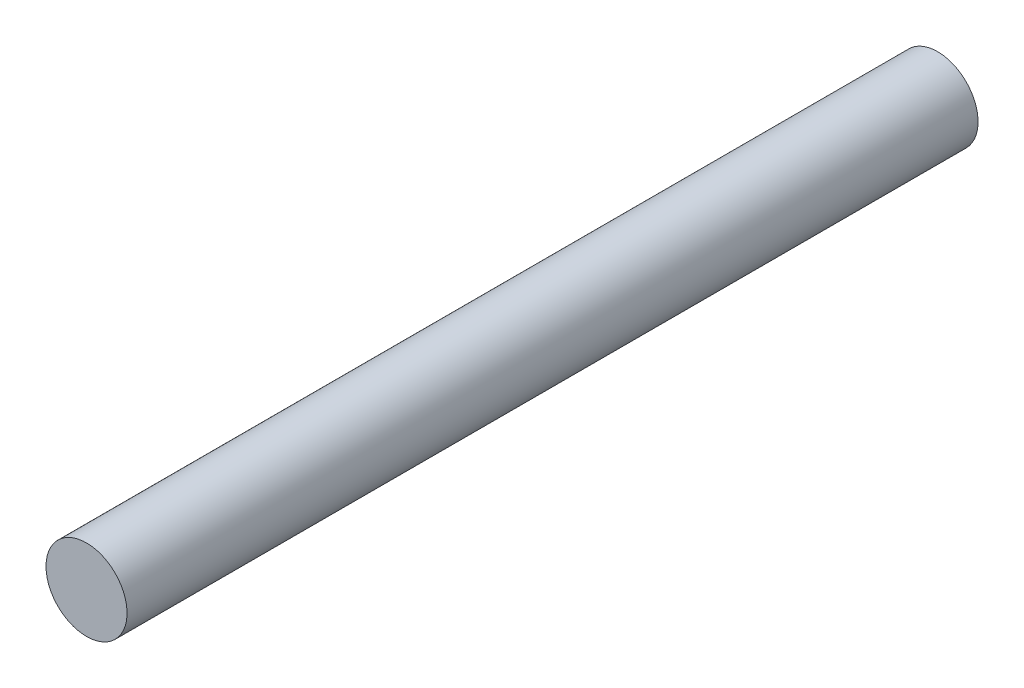
ISO-10303-21;
HEADER;
FILE_DESCRIPTION(('STEP AP214'),'2;1');
FILE_NAME('part.step','',(''),(''),'','','');
FILE_SCHEMA(('AUTOMOTIVE_DESIGN { 1 0 10303 214 1 1 1 1 }'));
ENDSEC;
DATA;
#1=APPLICATION_CONTEXT('core data for automotive mechanical design processes');
#2=APPLICATION_PROTOCOL_DEFINITION('international standard','automotive_design',2000,#1);
#3=PRODUCT_CONTEXT('',#1,'mechanical');
#4=PRODUCT('Part','Part','',(#3));
#5=PRODUCT_RELATED_PRODUCT_CATEGORY('part','',(#4));
#6=PRODUCT_DEFINITION_FORMATION('','',#4);
#7=PRODUCT_DEFINITION_CONTEXT('part definition',#1,'design');
#8=PRODUCT_DEFINITION('design','',#6,#7);
#9=PRODUCT_DEFINITION_SHAPE('','',#8);
#10=(LENGTH_UNIT() NAMED_UNIT(*) SI_UNIT(.MILLI.,.METRE.));
#11=(NAMED_UNIT(*) PLANE_ANGLE_UNIT() SI_UNIT($,.RADIAN.));
#12=(NAMED_UNIT(*) SI_UNIT($,.STERADIAN.) SOLID_ANGLE_UNIT());
#13=UNCERTAINTY_MEASURE_WITH_UNIT(LENGTH_MEASURE(1.E-05),#10,'distance_accuracy_value','');
#14=(GEOMETRIC_REPRESENTATION_CONTEXT(3) GLOBAL_UNCERTAINTY_ASSIGNED_CONTEXT((#13)) GLOBAL_UNIT_ASSIGNED_CONTEXT((#10,
#11,#12)) REPRESENTATION_CONTEXT('',''));
#15=CARTESIAN_POINT('',(0.,0.,0.));
#16=DIRECTION('',(0.,0.,1.));
#17=DIRECTION('',(1.,0.,0.));
#18=AXIS2_PLACEMENT_3D('',#15,#16,#17);
#19=CARTESIAN_POINT('',(0.,0.,0.));
#20=DIRECTION('',(0.,0.,1.));
#21=DIRECTION('',(1.,0.,0.));
#22=AXIS2_PLACEMENT_3D('',#19,#20,#21);
#23=PLANE('',#22);
#24=CARTESIAN_POINT('',(0.,0.,0.));
#25=DIRECTION('',(0.,0.,1.));
#26=DIRECTION('',(1.,0.,0.));
#27=AXIS2_PLACEMENT_3D('',#24,#25,#26);
#28=CIRCLE('',#27,5.);
#29=CARTESIAN_POINT('',(-5.,0.,0.));
#30=VERTEX_POINT('',#29);
#31=EDGE_CURVE('E38',#30,#30,#28,.T.);
#32=ORIENTED_EDGE('',*,*,#31,.F.);
#33=EDGE_LOOP('',(#32));
#34=FACE_BOUND('',#33,.T.);
#35=ADVANCED_FACE('F31',(#34),#23,.F.);
#36=CARTESIAN_POINT('',(0.,0.,119.142135623731));
#37=DIRECTION('',(0.,0.,-1.));
#38=DIRECTION('',(-1.,0.,0.));
#39=AXIS2_PLACEMENT_3D('',#36,#37,#38);
#40=CYLINDRICAL_SURFACE('',#39,5.);
#41=CARTESIAN_POINT('',(0.,0.,105.));
#42=DIRECTION('',(0.,0.,-1.));
#43=DIRECTION('',(0.,1.,0.));
#44=AXIS2_PLACEMENT_3D('',#41,#42,#43);
#45=CIRCLE('',#44,5.);
#46=CARTESIAN_POINT('',(-5.,0.,105.));
#47=VERTEX_POINT('',#46);
#48=EDGE_CURVE('E10',#47,#47,#45,.T.);
#49=CARTESIAN_POINT('',(-5.,0.,105.));
#50=CARTESIAN_POINT('',(-5.,0.,103.90625));
#51=CARTESIAN_POINT('',(-5.,0.,102.8125));
#52=CARTESIAN_POINT('',(-5.,0.,100.625));
#53=CARTESIAN_POINT('',(-5.,0.,99.53125));
#54=CARTESIAN_POINT('',(-5.,0.,97.34375));
#55=CARTESIAN_POINT('',(-5.,0.,96.25));
#56=CARTESIAN_POINT('',(-5.,0.,94.0625));
#57=CARTESIAN_POINT('',(-5.,0.,92.96875));
#58=CARTESIAN_POINT('',(-5.,0.,90.78125));
#59=CARTESIAN_POINT('',(-5.,0.,89.6875));
#60=CARTESIAN_POINT('',(-5.,0.,87.5));
#61=CARTESIAN_POINT('',(-5.,0.,86.40625));
#62=CARTESIAN_POINT('',(-5.,0.,84.21875));
#63=CARTESIAN_POINT('',(-5.,0.,83.125));
#64=CARTESIAN_POINT('',(-5.,0.,80.9375));
#65=CARTESIAN_POINT('',(-5.,0.,79.84375));
#66=CARTESIAN_POINT('',(-5.,0.,77.65625));
#67=CARTESIAN_POINT('',(-5.,0.,76.5625));
#68=CARTESIAN_POINT('',(-5.,0.,74.375));
#69=CARTESIAN_POINT('',(-5.,0.,73.28125));
#70=CARTESIAN_POINT('',(-5.,0.,71.09375));
#71=CARTESIAN_POINT('',(-5.,0.,70.));
#72=CARTESIAN_POINT('',(-5.,0.,67.8125));
#73=CARTESIAN_POINT('',(-5.,0.,66.71875));
#74=CARTESIAN_POINT('',(-5.,0.,64.53125));
#75=CARTESIAN_POINT('',(-5.,0.,63.4375));
#76=CARTESIAN_POINT('',(-5.,0.,61.25));
#77=CARTESIAN_POINT('',(-5.,0.,60.15625));
#78=CARTESIAN_POINT('',(-5.,0.,57.96875));
#79=CARTESIAN_POINT('',(-5.,0.,56.875));
#80=CARTESIAN_POINT('',(-5.,0.,54.6875));
#81=CARTESIAN_POINT('',(-5.,0.,53.59375));
#82=CARTESIAN_POINT('',(-5.,0.,51.40625));
#83=CARTESIAN_POINT('',(-5.,0.,50.3125));
#84=CARTESIAN_POINT('',(-5.,0.,48.125));
#85=CARTESIAN_POINT('',(-5.,0.,47.03125));
#86=CARTESIAN_POINT('',(-5.,0.,44.84375));
#87=CARTESIAN_POINT('',(-5.,0.,43.75));
#88=CARTESIAN_POINT('',(-5.,0.,41.5625));
#89=CARTESIAN_POINT('',(-5.,0.,40.46875));
#90=CARTESIAN_POINT('',(-5.,0.,38.28125));
#91=CARTESIAN_POINT('',(-5.,0.,37.1875));
#92=CARTESIAN_POINT('',(-5.,0.,35.));
#93=CARTESIAN_POINT('',(-5.,0.,33.90625));
#94=CARTESIAN_POINT('',(-5.,0.,31.71875));
#95=CARTESIAN_POINT('',(-5.,0.,30.625));
#96=CARTESIAN_POINT('',(-5.,0.,28.4375));
#97=CARTESIAN_POINT('',(-5.,0.,27.34375));
#98=CARTESIAN_POINT('',(-5.,0.,25.15625));
#99=CARTESIAN_POINT('',(-5.,0.,24.0625));
#100=CARTESIAN_POINT('',(-5.,0.,21.875));
#101=CARTESIAN_POINT('',(-5.,0.,20.78125));
#102=CARTESIAN_POINT('',(-5.,0.,18.59375));
#103=CARTESIAN_POINT('',(-5.,0.,17.5));
#104=CARTESIAN_POINT('',(-5.,0.,15.3125));
#105=CARTESIAN_POINT('',(-5.,0.,14.21875));
#106=CARTESIAN_POINT('',(-5.,0.,12.03125));
#107=CARTESIAN_POINT('',(-5.,0.,10.9375));
#108=CARTESIAN_POINT('',(-5.,0.,8.75));
#109=CARTESIAN_POINT('',(-5.,0.,7.65625));
#110=CARTESIAN_POINT('',(-5.,0.,5.46875));
#111=CARTESIAN_POINT('',(-5.,0.,4.375));
#112=CARTESIAN_POINT('',(-5.,0.,2.1875));
#113=CARTESIAN_POINT('',(-5.,0.,1.09375));
#114=CARTESIAN_POINT('',(-5.,0.,0.));
#115=B_SPLINE_CURVE_WITH_KNOTS('',3,(#49,#50,#51,#52,#53,#54,#55,#56,#57,#58,#59,#60,#61,#62,
#63,#64,#65,#66,#67,#68,#69,#70,#71,#72,#73,#74,#75,#76,#77,#78,#79,#80,#81,#82,#83,#84,#85,#86,
#87,#88,#89,#90,#91,#92,#93,#94,#95,#96,#97,#98,#99,#100,#101,#102,#103,#104,#105,#106,#107,
#108,#109,#110,#111,#112,#113,#114),.UNSPECIFIED.,.F.,.F.,(4,2,2,2,2,2,2,2,2,2,2,2,2,2,2,2,2,2,
2,2,2,2,2,2,2,2,2,2,2,2,2,2,4),(0.,3.28125,6.5625,9.84375,13.125,16.40625,19.6875,22.96875,
26.25,29.53125,32.8125,36.09375,39.375,42.65625,45.9375,49.21875,52.5,55.78125,59.0625,62.34375,
65.625,68.90625,72.1875,75.46875,78.75,82.03125,85.3125,88.59375,91.875,95.15625,98.4375,
101.71875,105.),.UNSPECIFIED.);
#116=EDGE_CURVE('BSEAM33',#47,#30,#115,.T.);
#117=ORIENTED_EDGE('',*,*,#48,.T.);
#118=ORIENTED_EDGE('',*,*,#31,.T.);
#119=ORIENTED_EDGE('',*,*,#116,.T.);
#120=ORIENTED_EDGE('',*,*,#116,.F.);
#121=EDGE_LOOP('',(#117,#119,#118,#120));
#122=FACE_BOUND('',#121,.T.);
#123=ADVANCED_FACE('F33',(#122),#40,.T.);
#124=CARTESIAN_POINT('',(-58.7739518500058,181.313567255302,105.));
#125=DIRECTION('',(0.,0.,-1.));
#126=DIRECTION('',(-0.23738376131793,0.971415951002737,0.));
#127=AXIS2_PLACEMENT_3D('',#124,#125,#126);
#128=PLANE('',#127);
#129=ORIENTED_EDGE('',*,*,#48,.F.);
#130=EDGE_LOOP('',(#129));
#131=FACE_BOUND('',#130,.T.);
#132=ADVANCED_FACE('F49',(#131),#128,.F.);
#133=CLOSED_SHELL('',(#35,#123,#132));
#134=MANIFOLD_SOLID_BREP('B2',#133);
#135=ADVANCED_BREP_SHAPE_REPRESENTATION('',(#18,#134),#14);
#136=SHAPE_DEFINITION_REPRESENTATION(#9,#135);
ENDSEC;
END-ISO-10303-21;
